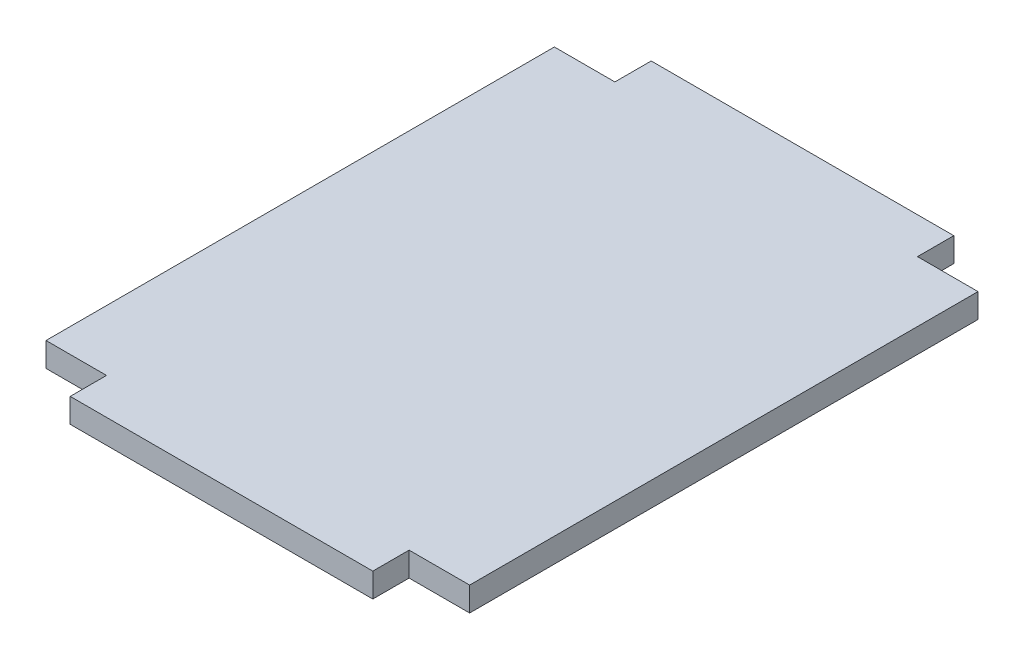
ISO-10303-21;
HEADER;
FILE_DESCRIPTION(('STEP AP214'),'2;1');
FILE_NAME('part.step','',(''),(''),'','','');
FILE_SCHEMA(('AUTOMOTIVE_DESIGN { 1 0 10303 214 1 1 1 1 }'));
ENDSEC;
DATA;
#1=APPLICATION_CONTEXT('core data for automotive mechanical design processes');
#2=APPLICATION_PROTOCOL_DEFINITION('international standard','automotive_design',2000,#1);
#3=PRODUCT_CONTEXT('',#1,'mechanical');
#4=PRODUCT('Part','Part','',(#3));
#5=PRODUCT_RELATED_PRODUCT_CATEGORY('part','',(#4));
#6=PRODUCT_DEFINITION_FORMATION('','',#4);
#7=PRODUCT_DEFINITION_CONTEXT('part definition',#1,'design');
#8=PRODUCT_DEFINITION('design','',#6,#7);
#9=PRODUCT_DEFINITION_SHAPE('','',#8);
#10=(LENGTH_UNIT() NAMED_UNIT(*) SI_UNIT(.MILLI.,.METRE.));
#11=(NAMED_UNIT(*) PLANE_ANGLE_UNIT() SI_UNIT($,.RADIAN.));
#12=(NAMED_UNIT(*) SI_UNIT($,.STERADIAN.) SOLID_ANGLE_UNIT());
#13=UNCERTAINTY_MEASURE_WITH_UNIT(LENGTH_MEASURE(1.E-05),#10,'distance_accuracy_value','');
#14=(GEOMETRIC_REPRESENTATION_CONTEXT(3) GLOBAL_UNCERTAINTY_ASSIGNED_CONTEXT((#13)) GLOBAL_UNIT_ASSIGNED_CONTEXT((#10,
#11,#12)) REPRESENTATION_CONTEXT('',''));
#15=CARTESIAN_POINT('',(0.,0.,0.));
#16=DIRECTION('',(0.,0.,1.));
#17=DIRECTION('',(1.,0.,0.));
#18=AXIS2_PLACEMENT_3D('',#15,#16,#17);
#19=CARTESIAN_POINT('',(23.,-53.5,70.079872407969));
#20=DIRECTION('',(1.,0.,0.));
#21=DIRECTION('',(0.,0.,-1.));
#22=AXIS2_PLACEMENT_3D('',#19,#20,#21);
#23=PLANE('',#22);
#24=DIRECTION('',(0.,0.,-1.));
#25=VECTOR('',#24,1.);
#26=CARTESIAN_POINT('',(23.,-55.5,70.079872407969));
#27=LINE('',#26,#25);
#28=CARTESIAN_POINT('',(23.,-55.5,0.));
#29=VERTEX_POINT('',#28);
#30=CARTESIAN_POINT('',(23.,-55.5,-3.));
#31=VERTEX_POINT('',#30);
#32=EDGE_CURVE('E312',#29,#31,#27,.T.);
#33=ORIENTED_EDGE('',*,*,#32,.F.);
#34=DIRECTION('',(0.,1.,0.));
#35=VECTOR('',#34,1.);
#36=CARTESIAN_POINT('',(23.,-53.5,0.));
#37=LINE('',#36,#35);
#38=CARTESIAN_POINT('',(23.,-53.5,0.));
#39=VERTEX_POINT('',#38);
#40=EDGE_CURVE('E132',#29,#39,#37,.T.);
#41=ORIENTED_EDGE('',*,*,#40,.T.);
#42=DIRECTION('',(0.,0.,-1.));
#43=VECTOR('',#42,1.);
#44=CARTESIAN_POINT('',(23.,-53.5,70.079872407969));
#45=LINE('',#44,#43);
#46=CARTESIAN_POINT('',(23.,-53.5,-3.));
#47=VERTEX_POINT('',#46);
#48=EDGE_CURVE('E173',#39,#47,#45,.T.);
#49=ORIENTED_EDGE('',*,*,#48,.T.);
#50=DIRECTION('',(0.,1.,0.));
#51=VECTOR('',#50,1.);
#52=CARTESIAN_POINT('',(23.,-53.5,-3.));
#53=LINE('',#52,#51);
#54=EDGE_CURVE('E271',#31,#47,#53,.T.);
#55=ORIENTED_EDGE('',*,*,#54,.F.);
#56=EDGE_LOOP('',(#33,#41,#49,#55));
#57=FACE_BOUND('',#56,.T.);
#58=ADVANCED_FACE('F34',(#57),#23,.F.);
#59=CARTESIAN_POINT('',(48.,-53.5,70.079872407969));
#60=DIRECTION('',(-1.,0.,0.));
#61=DIRECTION('',(0.,0.,1.));
#62=AXIS2_PLACEMENT_3D('',#59,#60,#61);
#63=PLANE('',#62);
#64=DIRECTION('',(0.,1.,0.));
#65=VECTOR('',#64,1.);
#66=CARTESIAN_POINT('',(48.,-53.5,0.));
#67=LINE('',#66,#65);
#68=CARTESIAN_POINT('',(48.,-55.5,0.));
#69=VERTEX_POINT('',#68);
#70=CARTESIAN_POINT('',(48.,-53.5,0.));
#71=VERTEX_POINT('',#70);
#72=EDGE_CURVE('E59',#69,#71,#67,.T.);
#73=ORIENTED_EDGE('',*,*,#72,.F.);
#74=DIRECTION('',(0.,0.,-1.));
#75=VECTOR('',#74,1.);
#76=CARTESIAN_POINT('',(48.,-55.5,70.079872407969));
#77=LINE('',#76,#75);
#78=CARTESIAN_POINT('',(48.,-55.5,-3.));
#79=VERTEX_POINT('',#78);
#80=EDGE_CURVE('E298',#69,#79,#77,.T.);
#81=ORIENTED_EDGE('',*,*,#80,.T.);
#82=DIRECTION('',(0.,-1.,0.));
#83=VECTOR('',#82,1.);
#84=CARTESIAN_POINT('',(48.,-53.5,-3.));
#85=LINE('',#84,#83);
#86=CARTESIAN_POINT('',(48.,-53.5,-3.));
#87=VERTEX_POINT('',#86);
#88=EDGE_CURVE('E313',#87,#79,#85,.T.);
#89=ORIENTED_EDGE('',*,*,#88,.F.);
#90=DIRECTION('',(0.,0.,-1.));
#91=VECTOR('',#90,1.);
#92=CARTESIAN_POINT('',(48.,-53.5,70.079872407969));
#93=LINE('',#92,#91);
#94=EDGE_CURVE('E191',#71,#87,#93,.T.);
#95=ORIENTED_EDGE('',*,*,#94,.F.);
#96=EDGE_LOOP('',(#73,#81,#89,#95));
#97=FACE_BOUND('',#96,.T.);
#98=ADVANCED_FACE('F36',(#97),#63,.F.);
#99=DIRECTION('',(0.,-1.,0.));
#100=VECTOR('',#99,1.);
#101=CARTESIAN_POINT('',(48.,-53.5,42.));
#102=LINE('',#101,#100);
#103=CARTESIAN_POINT('',(48.,-53.5,42.));
#104=VERTEX_POINT('',#103);
#105=CARTESIAN_POINT('',(48.,-55.5,42.));
#106=VERTEX_POINT('',#105);
#107=EDGE_CURVE('E269',#104,#106,#102,.T.);
#108=ORIENTED_EDGE('',*,*,#107,.F.);
#109=CARTESIAN_POINT('',(48.,-53.5,45.));
#110=VERTEX_POINT('',#109);
#111=EDGE_CURVE('E193',#110,#104,#93,.T.);
#112=ORIENTED_EDGE('',*,*,#111,.F.);
#113=DIRECTION('',(0.,-1.,0.));
#114=VECTOR('',#113,1.);
#115=CARTESIAN_POINT('',(48.,-53.5,45.));
#116=LINE('',#115,#114);
#117=CARTESIAN_POINT('',(48.,-55.5,45.));
#118=VERTEX_POINT('',#117);
#119=EDGE_CURVE('E11',#110,#118,#116,.T.);
#120=ORIENTED_EDGE('',*,*,#119,.T.);
#121=EDGE_CURVE('E310',#118,#106,#77,.T.);
#122=ORIENTED_EDGE('',*,*,#121,.T.);
#123=EDGE_LOOP('',(#108,#112,#120,#122));
#124=FACE_BOUND('',#123,.T.);
#125=ADVANCED_FACE('F228',(#124),#63,.F.);
#126=CARTESIAN_POINT('',(48.,-55.5,70.079872407969));
#127=DIRECTION('',(0.,1.,0.));
#128=DIRECTION('',(-1.,0.,0.));
#129=AXIS2_PLACEMENT_3D('',#126,#127,#128);
#130=PLANE('',#129);
#131=ORIENTED_EDGE('',*,*,#121,.F.);
#132=DIRECTION('',(-1.,0.,0.));
#133=VECTOR('',#132,1.);
#134=CARTESIAN_POINT('',(48.,-55.5,45.));
#135=LINE('',#134,#133);
#136=CARTESIAN_POINT('',(23.,-55.5,45.));
#137=VERTEX_POINT('',#136);
#138=EDGE_CURVE('E187',#118,#137,#135,.T.);
#139=ORIENTED_EDGE('',*,*,#138,.T.);
#140=CARTESIAN_POINT('',(23.,-55.5,42.));
#141=VERTEX_POINT('',#140);
#142=EDGE_CURVE('E177',#137,#141,#27,.T.);
#143=ORIENTED_EDGE('',*,*,#142,.T.);
#144=DIRECTION('',(1.,0.,0.));
#145=VECTOR('',#144,1.);
#146=CARTESIAN_POINT('',(18.,-55.5,42.));
#147=LINE('',#146,#145);
#148=CARTESIAN_POINT('',(18.,-55.5,42.));
#149=VERTEX_POINT('',#148);
#150=EDGE_CURVE('E51',#149,#141,#147,.T.);
#151=ORIENTED_EDGE('',*,*,#150,.F.);
#152=DIRECTION('',(0.,0.,-1.));
#153=VECTOR('',#152,1.);
#154=CARTESIAN_POINT('',(18.,-55.5,0.));
#155=LINE('',#154,#153);
#156=CARTESIAN_POINT('',(18.,-55.5,0.));
#157=VERTEX_POINT('',#156);
#158=EDGE_CURVE('E140',#149,#157,#155,.T.);
#159=ORIENTED_EDGE('',*,*,#158,.T.);
#160=DIRECTION('',(1.,0.,0.));
#161=VECTOR('',#160,1.);
#162=CARTESIAN_POINT('',(18.,-55.5,0.));
#163=LINE('',#162,#161);
#164=EDGE_CURVE('E126',#157,#29,#163,.T.);
#165=ORIENTED_EDGE('',*,*,#164,.T.);
#166=ORIENTED_EDGE('',*,*,#32,.T.);
#167=DIRECTION('',(-1.,0.,0.));
#168=VECTOR('',#167,1.);
#169=CARTESIAN_POINT('',(48.,-55.5,-3.));
#170=LINE('',#169,#168);
#171=EDGE_CURVE('E275',#79,#31,#170,.T.);
#172=ORIENTED_EDGE('',*,*,#171,.F.);
#173=ORIENTED_EDGE('',*,*,#80,.F.);
#174=DIRECTION('',(-1.,0.,0.));
#175=VECTOR('',#174,1.);
#176=CARTESIAN_POINT('',(53.,-55.5,0.));
#177=LINE('',#176,#175);
#178=CARTESIAN_POINT('',(53.,-55.5,0.));
#179=VERTEX_POINT('',#178);
#180=EDGE_CURVE('E286',#179,#69,#177,.T.);
#181=ORIENTED_EDGE('',*,*,#180,.F.);
#182=DIRECTION('',(0.,0.,-1.));
#183=VECTOR('',#182,1.);
#184=CARTESIAN_POINT('',(53.,-55.5,0.));
#185=LINE('',#184,#183);
#186=CARTESIAN_POINT('',(53.,-55.5,42.));
#187=VERTEX_POINT('',#186);
#188=EDGE_CURVE('E266',#187,#179,#185,.T.);
#189=ORIENTED_EDGE('',*,*,#188,.F.);
#190=DIRECTION('',(-1.,0.,0.));
#191=VECTOR('',#190,1.);
#192=CARTESIAN_POINT('',(53.,-55.5,42.));
#193=LINE('',#192,#191);
#194=EDGE_CURVE('E277',#187,#106,#193,.T.);
#195=ORIENTED_EDGE('',*,*,#194,.T.);
#196=EDGE_LOOP('',(#131,#139,#143,#151,#159,#165,#166,#172,#173,#181,#189,#195));
#197=FACE_BOUND('',#196,.T.);
#198=ADVANCED_FACE('F146',(#197),#130,.F.);
#199=CARTESIAN_POINT('',(23.,-53.5,45.));
#200=VERTEX_POINT('',#199);
#201=CARTESIAN_POINT('',(23.,-53.5,42.));
#202=VERTEX_POINT('',#201);
#203=EDGE_CURVE('E176',#200,#202,#45,.T.);
#204=ORIENTED_EDGE('',*,*,#203,.T.);
#205=DIRECTION('',(0.,-1.,0.));
#206=VECTOR('',#205,1.);
#207=CARTESIAN_POINT('',(23.,-53.5,42.));
#208=LINE('',#207,#206);
#209=EDGE_CURVE('E143',#202,#141,#208,.T.);
#210=ORIENTED_EDGE('',*,*,#209,.T.);
#211=ORIENTED_EDGE('',*,*,#142,.F.);
#212=DIRECTION('',(0.,1.,0.));
#213=VECTOR('',#212,1.);
#214=CARTESIAN_POINT('',(23.,-53.5,45.));
#215=LINE('',#214,#213);
#216=EDGE_CURVE('E201',#137,#200,#215,.T.);
#217=ORIENTED_EDGE('',*,*,#216,.T.);
#218=EDGE_LOOP('',(#204,#210,#211,#217));
#219=FACE_BOUND('',#218,.T.);
#220=ADVANCED_FACE('F209',(#219),#23,.F.);
#221=CARTESIAN_POINT('',(48.,-53.5,70.079872407969));
#222=DIRECTION('',(0.,-1.,0.));
#223=DIRECTION('',(0.,0.,-1.));
#224=AXIS2_PLACEMENT_3D('',#221,#222,#223);
#225=PLANE('',#224);
#226=ORIENTED_EDGE('',*,*,#203,.F.);
#227=DIRECTION('',(1.,0.,0.));
#228=VECTOR('',#227,1.);
#229=CARTESIAN_POINT('',(48.,-53.5,45.));
#230=LINE('',#229,#228);
#231=EDGE_CURVE('E43',#200,#110,#230,.T.);
#232=ORIENTED_EDGE('',*,*,#231,.T.);
#233=ORIENTED_EDGE('',*,*,#111,.T.);
#234=DIRECTION('',(-1.,0.,0.));
#235=VECTOR('',#234,1.);
#236=CARTESIAN_POINT('',(53.,-53.5,42.));
#237=LINE('',#236,#235);
#238=CARTESIAN_POINT('',(53.,-53.5,42.));
#239=VERTEX_POINT('',#238);
#240=EDGE_CURVE('E272',#239,#104,#237,.T.);
#241=ORIENTED_EDGE('',*,*,#240,.F.);
#242=DIRECTION('',(0.,0.,1.));
#243=VECTOR('',#242,1.);
#244=CARTESIAN_POINT('',(53.,-53.5,0.));
#245=LINE('',#244,#243);
#246=CARTESIAN_POINT('',(53.,-53.5,0.));
#247=VERTEX_POINT('',#246);
#248=EDGE_CURVE('E264',#247,#239,#245,.T.);
#249=ORIENTED_EDGE('',*,*,#248,.F.);
#250=DIRECTION('',(-1.,0.,0.));
#251=VECTOR('',#250,1.);
#252=CARTESIAN_POINT('',(53.,-53.5,0.));
#253=LINE('',#252,#251);
#254=EDGE_CURVE('E270',#247,#71,#253,.T.);
#255=ORIENTED_EDGE('',*,*,#254,.T.);
#256=ORIENTED_EDGE('',*,*,#94,.T.);
#257=DIRECTION('',(1.,0.,0.));
#258=VECTOR('',#257,1.);
#259=CARTESIAN_POINT('',(48.,-53.5,-3.));
#260=LINE('',#259,#258);
#261=EDGE_CURVE('E311',#47,#87,#260,.T.);
#262=ORIENTED_EDGE('',*,*,#261,.F.);
#263=ORIENTED_EDGE('',*,*,#48,.F.);
#264=DIRECTION('',(1.,0.,0.));
#265=VECTOR('',#264,1.);
#266=CARTESIAN_POINT('',(18.,-53.5,0.));
#267=LINE('',#266,#265);
#268=CARTESIAN_POINT('',(18.,-53.5,0.));
#269=VERTEX_POINT('',#268);
#270=EDGE_CURVE('E155',#269,#39,#267,.T.);
#271=ORIENTED_EDGE('',*,*,#270,.F.);
#272=DIRECTION('',(0.,0.,1.));
#273=VECTOR('',#272,1.);
#274=CARTESIAN_POINT('',(18.,-53.5,0.));
#275=LINE('',#274,#273);
#276=CARTESIAN_POINT('',(18.,-53.5,42.));
#277=VERTEX_POINT('',#276);
#278=EDGE_CURVE('E142',#269,#277,#275,.T.);
#279=ORIENTED_EDGE('',*,*,#278,.T.);
#280=DIRECTION('',(1.,0.,0.));
#281=VECTOR('',#280,1.);
#282=CARTESIAN_POINT('',(18.,-53.5,42.));
#283=LINE('',#282,#281);
#284=EDGE_CURVE('E165',#277,#202,#283,.T.);
#285=ORIENTED_EDGE('',*,*,#284,.T.);
#286=EDGE_LOOP('',(#226,#232,#233,#241,#249,#255,#256,#262,#263,#271,#279,#285));
#287=FACE_BOUND('',#286,.T.);
#288=ADVANCED_FACE('F211',(#287),#225,.F.);
#289=CARTESIAN_POINT('',(35.5,0.,45.));
#290=DIRECTION('',(0.,0.,-1.));
#291=DIRECTION('',(1.,0.,0.));
#292=AXIS2_PLACEMENT_3D('',#289,#290,#291);
#293=PLANE('',#292);
#294=ORIENTED_EDGE('',*,*,#231,.F.);
#295=ORIENTED_EDGE('',*,*,#216,.F.);
#296=ORIENTED_EDGE('',*,*,#138,.F.);
#297=ORIENTED_EDGE('',*,*,#119,.F.);
#298=EDGE_LOOP('',(#294,#295,#296,#297));
#299=FACE_BOUND('',#298,.T.);
#300=ADVANCED_FACE('F235',(#299),#293,.F.);
#301=CARTESIAN_POINT('',(0.,0.,-3.));
#302=DIRECTION('',(0.,0.,1.));
#303=DIRECTION('',(0.,-1.,0.));
#304=AXIS2_PLACEMENT_3D('',#301,#302,#303);
#305=PLANE('',#304);
#306=ORIENTED_EDGE('',*,*,#88,.T.);
#307=ORIENTED_EDGE('',*,*,#171,.T.);
#308=ORIENTED_EDGE('',*,*,#54,.T.);
#309=ORIENTED_EDGE('',*,*,#261,.T.);
#310=EDGE_LOOP('',(#306,#307,#308,#309));
#311=FACE_BOUND('',#310,.T.);
#312=ADVANCED_FACE('F243',(#311),#305,.F.);
#313=CARTESIAN_POINT('',(53.,-53.5,0.));
#314=DIRECTION('',(0.,0.,1.));
#315=DIRECTION('',(0.,-1.,0.));
#316=AXIS2_PLACEMENT_3D('',#313,#314,#315);
#317=PLANE('',#316);
#318=ORIENTED_EDGE('',*,*,#72,.T.);
#319=ORIENTED_EDGE('',*,*,#254,.F.);
#320=DIRECTION('',(0.,1.,0.));
#321=VECTOR('',#320,1.);
#322=CARTESIAN_POINT('',(53.,-53.5,0.));
#323=LINE('',#322,#321);
#324=EDGE_CURVE('E262',#179,#247,#323,.T.);
#325=ORIENTED_EDGE('',*,*,#324,.F.);
#326=ORIENTED_EDGE('',*,*,#180,.T.);
#327=EDGE_LOOP('',(#318,#319,#325,#326));
#328=FACE_BOUND('',#327,.T.);
#329=ADVANCED_FACE('F247',(#328),#317,.F.);
#330=CARTESIAN_POINT('',(53.,-53.5,42.));
#331=DIRECTION('',(0.,0.,-1.));
#332=DIRECTION('',(-1.,0.,0.));
#333=AXIS2_PLACEMENT_3D('',#330,#331,#332);
#334=PLANE('',#333);
#335=ORIENTED_EDGE('',*,*,#107,.T.);
#336=ORIENTED_EDGE('',*,*,#194,.F.);
#337=DIRECTION('',(0.,-1.,0.));
#338=VECTOR('',#337,1.);
#339=CARTESIAN_POINT('',(53.,-53.5,42.));
#340=LINE('',#339,#338);
#341=EDGE_CURVE('E303',#239,#187,#340,.T.);
#342=ORIENTED_EDGE('',*,*,#341,.F.);
#343=ORIENTED_EDGE('',*,*,#240,.T.);
#344=EDGE_LOOP('',(#335,#336,#342,#343));
#345=FACE_BOUND('',#344,.T.);
#346=ADVANCED_FACE('F251',(#345),#334,.F.);
#347=CARTESIAN_POINT('',(53.,0.,0.));
#348=DIRECTION('',(-1.,0.,0.));
#349=DIRECTION('',(0.,0.,1.));
#350=AXIS2_PLACEMENT_3D('',#347,#348,#349);
#351=PLANE('',#350);
#352=ORIENTED_EDGE('',*,*,#324,.T.);
#353=ORIENTED_EDGE('',*,*,#248,.T.);
#354=ORIENTED_EDGE('',*,*,#341,.T.);
#355=ORIENTED_EDGE('',*,*,#188,.T.);
#356=EDGE_LOOP('',(#352,#353,#354,#355));
#357=FACE_BOUND('',#356,.T.);
#358=ADVANCED_FACE('F220',(#357),#351,.F.);
#359=CARTESIAN_POINT('',(18.,-53.5,0.));
#360=DIRECTION('',(0.,0.,-1.));
#361=DIRECTION('',(0.,1.,0.));
#362=AXIS2_PLACEMENT_3D('',#359,#360,#361);
#363=PLANE('',#362);
#364=ORIENTED_EDGE('',*,*,#40,.F.);
#365=ORIENTED_EDGE('',*,*,#164,.F.);
#366=DIRECTION('',(0.,1.,0.));
#367=VECTOR('',#366,1.);
#368=CARTESIAN_POINT('',(18.,-53.5,0.));
#369=LINE('',#368,#367);
#370=EDGE_CURVE('E129',#157,#269,#369,.T.);
#371=ORIENTED_EDGE('',*,*,#370,.T.);
#372=ORIENTED_EDGE('',*,*,#270,.T.);
#373=EDGE_LOOP('',(#364,#365,#371,#372));
#374=FACE_BOUND('',#373,.T.);
#375=ADVANCED_FACE('F128',(#374),#363,.T.);
#376=CARTESIAN_POINT('',(18.,-53.5,42.));
#377=DIRECTION('',(0.,0.,1.));
#378=DIRECTION('',(1.,0.,0.));
#379=AXIS2_PLACEMENT_3D('',#376,#377,#378);
#380=PLANE('',#379);
#381=ORIENTED_EDGE('',*,*,#209,.F.);
#382=ORIENTED_EDGE('',*,*,#284,.F.);
#383=DIRECTION('',(0.,-1.,0.));
#384=VECTOR('',#383,1.);
#385=CARTESIAN_POINT('',(18.,-53.5,42.));
#386=LINE('',#385,#384);
#387=EDGE_CURVE('E149',#277,#149,#386,.T.);
#388=ORIENTED_EDGE('',*,*,#387,.T.);
#389=ORIENTED_EDGE('',*,*,#150,.T.);
#390=EDGE_LOOP('',(#381,#382,#388,#389));
#391=FACE_BOUND('',#390,.T.);
#392=ADVANCED_FACE('F212',(#391),#380,.T.);
#393=CARTESIAN_POINT('',(18.,0.,0.));
#394=DIRECTION('',(1.,0.,0.));
#395=DIRECTION('',(0.,0.,1.));
#396=AXIS2_PLACEMENT_3D('',#393,#394,#395);
#397=PLANE('',#396);
#398=ORIENTED_EDGE('',*,*,#370,.F.);
#399=ORIENTED_EDGE('',*,*,#158,.F.);
#400=ORIENTED_EDGE('',*,*,#387,.F.);
#401=ORIENTED_EDGE('',*,*,#278,.F.);
#402=EDGE_LOOP('',(#398,#399,#400,#401));
#403=FACE_BOUND('',#402,.T.);
#404=ADVANCED_FACE('F138',(#403),#397,.F.);
#405=CLOSED_SHELL('',(#58,#98,#125,#198,#220,#288,#300,#312,#329,#346,#358,#375,#392,#404));
#406=MANIFOLD_SOLID_BREP('B2',#405);
#407=ADVANCED_BREP_SHAPE_REPRESENTATION('',(#18,#406),#14);
#408=SHAPE_DEFINITION_REPRESENTATION(#9,#407);
ENDSEC;
END-ISO-10303-21;
